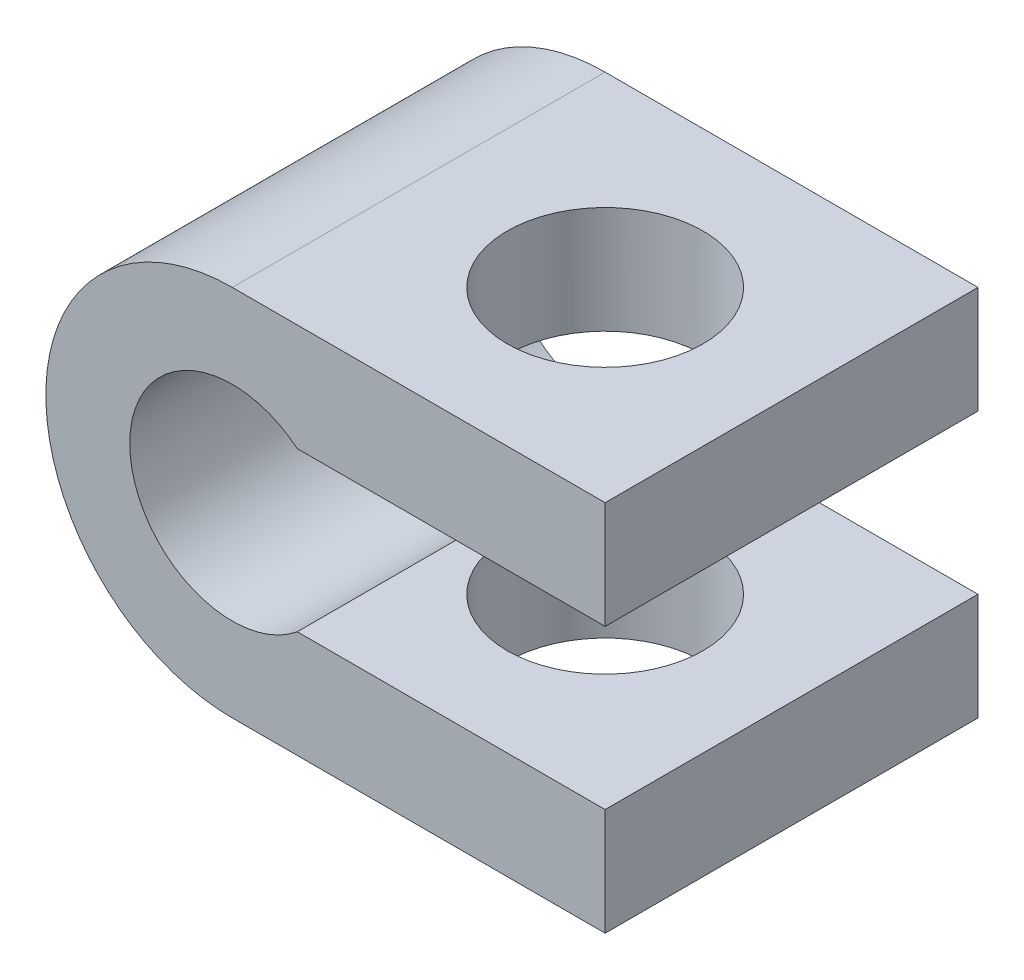
ISO-10303-21;
HEADER;
FILE_DESCRIPTION(('STEP AP214'),'2;1');
FILE_NAME('part.step','',(''),(''),'','','');
FILE_SCHEMA(('AUTOMOTIVE_DESIGN { 1 0 10303 214 1 1 1 1 }'));
ENDSEC;
DATA;
#1=APPLICATION_CONTEXT('core data for automotive mechanical design processes');
#2=APPLICATION_PROTOCOL_DEFINITION('international standard','automotive_design',2000,#1);
#3=PRODUCT_CONTEXT('',#1,'mechanical');
#4=PRODUCT('Part','Part','',(#3));
#5=PRODUCT_RELATED_PRODUCT_CATEGORY('part','',(#4));
#6=PRODUCT_DEFINITION_FORMATION('','',#4);
#7=PRODUCT_DEFINITION_CONTEXT('part definition',#1,'design');
#8=PRODUCT_DEFINITION('design','',#6,#7);
#9=PRODUCT_DEFINITION_SHAPE('','',#8);
#10=(LENGTH_UNIT() NAMED_UNIT(*) SI_UNIT(.MILLI.,.METRE.));
#11=(NAMED_UNIT(*) PLANE_ANGLE_UNIT() SI_UNIT($,.RADIAN.));
#12=(NAMED_UNIT(*) SI_UNIT($,.STERADIAN.) SOLID_ANGLE_UNIT());
#13=UNCERTAINTY_MEASURE_WITH_UNIT(LENGTH_MEASURE(1.E-05),#10,'distance_accuracy_value','');
#14=(GEOMETRIC_REPRESENTATION_CONTEXT(3) GLOBAL_UNCERTAINTY_ASSIGNED_CONTEXT((#13)) GLOBAL_UNIT_ASSIGNED_CONTEXT((#10,
#11,#12)) REPRESENTATION_CONTEXT('',''));
#15=CARTESIAN_POINT('',(0.,0.,0.));
#16=DIRECTION('',(0.,0.,1.));
#17=DIRECTION('',(1.,0.,0.));
#18=AXIS2_PLACEMENT_3D('',#15,#16,#17);
#19=CARTESIAN_POINT('',(0.,0.,12.));
#20=DIRECTION('',(0.,0.,-1.));
#21=DIRECTION('',(-1.,0.,0.));
#22=AXIS2_PLACEMENT_3D('',#19,#20,#21);
#23=CYLINDRICAL_SURFACE('',#22,3.3);
#24=CARTESIAN_POINT('',(0.,0.,0.));
#25=DIRECTION('',(0.,0.,-1.));
#26=DIRECTION('',(1.,0.,0.));
#27=AXIS2_PLACEMENT_3D('',#24,#25,#26);
#28=CIRCLE('',#27,3.3);
#29=CARTESIAN_POINT('',(2.09133180710731,-2.55271057360235,0.));
#30=VERTEX_POINT('',#29);
#31=CARTESIAN_POINT('',(2.09133180710731,2.55271057360235,0.));
#32=VERTEX_POINT('',#31);
#33=EDGE_CURVE('E131',#30,#32,#28,.T.);
#34=ORIENTED_EDGE('',*,*,#33,.T.);
#35=DIRECTION('',(0.,0.,-1.));
#36=VECTOR('',#35,1.);
#37=CARTESIAN_POINT('',(2.09133180710731,2.55271057360235,12.));
#38=LINE('',#37,#36);
#39=CARTESIAN_POINT('',(2.09133180710731,2.55271057360235,12.));
#40=VERTEX_POINT('',#39);
#41=EDGE_CURVE('E11',#40,#32,#38,.T.);
#42=ORIENTED_EDGE('',*,*,#41,.F.);
#43=CARTESIAN_POINT('',(0.,0.,12.));
#44=DIRECTION('',(0.,0.,-1.));
#45=DIRECTION('',(1.,0.,0.));
#46=AXIS2_PLACEMENT_3D('',#43,#44,#45);
#47=CIRCLE('',#46,3.3);
#48=CARTESIAN_POINT('',(2.09133180710731,-2.55271057360235,12.));
#49=VERTEX_POINT('',#48);
#50=EDGE_CURVE('E146',#49,#40,#47,.T.);
#51=ORIENTED_EDGE('',*,*,#50,.F.);
#52=DIRECTION('',(0.,0.,-1.));
#53=VECTOR('',#52,1.);
#54=CARTESIAN_POINT('',(2.09133180710731,-2.55271057360235,12.));
#55=LINE('',#54,#53);
#56=EDGE_CURVE('E127',#49,#30,#55,.T.);
#57=ORIENTED_EDGE('',*,*,#56,.T.);
#58=EDGE_LOOP('',(#34,#42,#51,#57));
#59=FACE_BOUND('',#58,.T.);
#60=ADVANCED_FACE('F34',(#59),#23,.F.);
#61=CARTESIAN_POINT('',(12.,2.55271057360235,12.));
#62=DIRECTION('',(0.,1.,0.));
#63=DIRECTION('',(-1.,0.,0.));
#64=AXIS2_PLACEMENT_3D('',#61,#62,#63);
#65=PLANE('',#64);
#66=CARTESIAN_POINT('',(6.,2.55271057360235,6.));
#67=DIRECTION('',(0.,1.,0.));
#68=DIRECTION('',(-1.,0.,0.));
#69=AXIS2_PLACEMENT_3D('',#66,#67,#68);
#70=CIRCLE('',#69,3.15);
#71=CARTESIAN_POINT('',(2.85,2.55271057360235,6.));
#72=VERTEX_POINT('',#71);
#73=EDGE_CURVE('E135',#72,#72,#70,.T.);
#74=ORIENTED_EDGE('',*,*,#73,.T.);
#75=EDGE_LOOP('',(#74));
#76=FACE_BOUND('',#75,.T.);
#77=DIRECTION('',(1.,0.,0.));
#78=VECTOR('',#77,1.);
#79=CARTESIAN_POINT('',(12.,2.55271057360235,0.));
#80=LINE('',#79,#78);
#81=CARTESIAN_POINT('',(12.,2.55271057360235,0.));
#82=VERTEX_POINT('',#81);
#83=EDGE_CURVE('E134',#32,#82,#80,.T.);
#84=ORIENTED_EDGE('',*,*,#83,.T.);
#85=DIRECTION('',(0.,0.,-1.));
#86=VECTOR('',#85,1.);
#87=CARTESIAN_POINT('',(12.,2.55271057360235,12.));
#88=LINE('',#87,#86);
#89=CARTESIAN_POINT('',(12.,2.55271057360235,12.));
#90=VERTEX_POINT('',#89);
#91=EDGE_CURVE('E43',#90,#82,#88,.T.);
#92=ORIENTED_EDGE('',*,*,#91,.F.);
#93=DIRECTION('',(1.,0.,0.));
#94=VECTOR('',#93,1.);
#95=CARTESIAN_POINT('',(12.,2.55271057360235,12.));
#96=LINE('',#95,#94);
#97=EDGE_CURVE('E94',#40,#90,#96,.T.);
#98=ORIENTED_EDGE('',*,*,#97,.F.);
#99=ORIENTED_EDGE('',*,*,#41,.T.);
#100=EDGE_LOOP('',(#84,#92,#98,#99));
#101=FACE_BOUND('',#100,.T.);
#102=ADVANCED_FACE('F199',(#76,#101),#65,.F.);
#103=CARTESIAN_POINT('',(12.,6.,12.));
#104=DIRECTION('',(-1.,0.,0.));
#105=DIRECTION('',(0.,0.,1.));
#106=AXIS2_PLACEMENT_3D('',#103,#104,#105);
#107=PLANE('',#106);
#108=DIRECTION('',(0.,1.,0.));
#109=VECTOR('',#108,1.);
#110=CARTESIAN_POINT('',(12.,6.,0.));
#111=LINE('',#110,#109);
#112=CARTESIAN_POINT('',(12.,6.,0.));
#113=VERTEX_POINT('',#112);
#114=EDGE_CURVE('E137',#82,#113,#111,.T.);
#115=ORIENTED_EDGE('',*,*,#114,.T.);
#116=DIRECTION('',(0.,0.,-1.));
#117=VECTOR('',#116,1.);
#118=CARTESIAN_POINT('',(12.,6.,12.));
#119=LINE('',#118,#117);
#120=CARTESIAN_POINT('',(12.,6.,12.));
#121=VERTEX_POINT('',#120);
#122=EDGE_CURVE('E153',#121,#113,#119,.T.);
#123=ORIENTED_EDGE('',*,*,#122,.F.);
#124=DIRECTION('',(0.,1.,0.));
#125=VECTOR('',#124,1.);
#126=CARTESIAN_POINT('',(12.,6.,12.));
#127=LINE('',#126,#125);
#128=EDGE_CURVE('E162',#90,#121,#127,.T.);
#129=ORIENTED_EDGE('',*,*,#128,.F.);
#130=ORIENTED_EDGE('',*,*,#91,.T.);
#131=EDGE_LOOP('',(#115,#123,#129,#130));
#132=FACE_BOUND('',#131,.T.);
#133=ADVANCED_FACE('F160',(#132),#107,.F.);
#134=CARTESIAN_POINT('',(0.,6.,12.));
#135=DIRECTION('',(0.,-1.,0.));
#136=DIRECTION('',(0.,0.,-1.));
#137=AXIS2_PLACEMENT_3D('',#134,#135,#136);
#138=PLANE('',#137);
#139=CARTESIAN_POINT('',(6.,6.,6.));
#140=DIRECTION('',(0.,1.,0.));
#141=DIRECTION('',(0.,0.,1.));
#142=AXIS2_PLACEMENT_3D('',#139,#140,#141);
#143=CIRCLE('',#142,3.15);
#144=CARTESIAN_POINT('',(6.,6.,9.15));
#145=VERTEX_POINT('',#144);
#146=EDGE_CURVE('E185',#145,#145,#143,.T.);
#147=ORIENTED_EDGE('',*,*,#146,.F.);
#148=EDGE_LOOP('',(#147));
#149=FACE_BOUND('',#148,.T.);
#150=DIRECTION('',(-1.,0.,0.));
#151=VECTOR('',#150,1.);
#152=CARTESIAN_POINT('',(0.,6.,0.));
#153=LINE('',#152,#151);
#154=CARTESIAN_POINT('',(0.,6.,0.));
#155=VERTEX_POINT('',#154);
#156=EDGE_CURVE('E139',#113,#155,#153,.T.);
#157=ORIENTED_EDGE('',*,*,#156,.T.);
#158=DIRECTION('',(0.,0.,-1.));
#159=VECTOR('',#158,1.);
#160=CARTESIAN_POINT('',(0.,6.,12.));
#161=LINE('',#160,#159);
#162=CARTESIAN_POINT('',(0.,6.,12.));
#163=VERTEX_POINT('',#162);
#164=EDGE_CURVE('E150',#163,#155,#161,.T.);
#165=ORIENTED_EDGE('',*,*,#164,.F.);
#166=DIRECTION('',(-1.,0.,0.));
#167=VECTOR('',#166,1.);
#168=CARTESIAN_POINT('',(0.,6.,12.));
#169=LINE('',#168,#167);
#170=EDGE_CURVE('E174',#121,#163,#169,.T.);
#171=ORIENTED_EDGE('',*,*,#170,.F.);
#172=ORIENTED_EDGE('',*,*,#122,.T.);
#173=EDGE_LOOP('',(#157,#165,#171,#172));
#174=FACE_BOUND('',#173,.T.);
#175=ADVANCED_FACE('F170',(#149,#174),#138,.F.);
#176=CARTESIAN_POINT('',(0.,0.,12.));
#177=DIRECTION('',(0.,0.,-1.));
#178=DIRECTION('',(-1.,0.,0.));
#179=AXIS2_PLACEMENT_3D('',#176,#177,#178);
#180=CYLINDRICAL_SURFACE('',#179,6.);
#181=CARTESIAN_POINT('',(0.,0.,0.));
#182=DIRECTION('',(0.,0.,1.));
#183=DIRECTION('',(1.,0.,0.));
#184=AXIS2_PLACEMENT_3D('',#181,#182,#183);
#185=CIRCLE('',#184,6.);
#186=CARTESIAN_POINT('',(0.,-6.,0.));
#187=VERTEX_POINT('',#186);
#188=EDGE_CURVE('E141',#155,#187,#185,.T.);
#189=ORIENTED_EDGE('',*,*,#188,.T.);
#190=DIRECTION('',(0.,0.,-1.));
#191=VECTOR('',#190,1.);
#192=CARTESIAN_POINT('',(0.,-6.,12.));
#193=LINE('',#192,#191);
#194=CARTESIAN_POINT('',(0.,-6.,12.));
#195=VERTEX_POINT('',#194);
#196=EDGE_CURVE('E122',#195,#187,#193,.T.);
#197=ORIENTED_EDGE('',*,*,#196,.F.);
#198=CARTESIAN_POINT('',(0.,0.,12.));
#199=DIRECTION('',(0.,0.,1.));
#200=DIRECTION('',(1.,0.,0.));
#201=AXIS2_PLACEMENT_3D('',#198,#199,#200);
#202=CIRCLE('',#201,6.);
#203=EDGE_CURVE('E113',#163,#195,#202,.T.);
#204=ORIENTED_EDGE('',*,*,#203,.F.);
#205=ORIENTED_EDGE('',*,*,#164,.T.);
#206=EDGE_LOOP('',(#189,#197,#204,#205));
#207=FACE_BOUND('',#206,.T.);
#208=ADVANCED_FACE('F173',(#207),#180,.T.);
#209=CARTESIAN_POINT('',(0.,-6.,12.));
#210=DIRECTION('',(0.,1.,0.));
#211=DIRECTION('',(0.,0.,1.));
#212=AXIS2_PLACEMENT_3D('',#209,#210,#211);
#213=PLANE('',#212);
#214=CARTESIAN_POINT('',(6.,-6.,6.));
#215=DIRECTION('',(0.,1.,0.));
#216=DIRECTION('',(0.,0.,1.));
#217=AXIS2_PLACEMENT_3D('',#214,#215,#216);
#218=CIRCLE('',#217,3.15);
#219=CARTESIAN_POINT('',(6.,-6.,9.15));
#220=VERTEX_POINT('',#219);
#221=EDGE_CURVE('E182',#220,#220,#218,.T.);
#222=ORIENTED_EDGE('',*,*,#221,.T.);
#223=EDGE_LOOP('',(#222));
#224=FACE_BOUND('',#223,.T.);
#225=DIRECTION('',(1.,0.,0.));
#226=VECTOR('',#225,1.);
#227=CARTESIAN_POINT('',(0.,-6.,0.));
#228=LINE('',#227,#226);
#229=CARTESIAN_POINT('',(12.,-6.,0.));
#230=VERTEX_POINT('',#229);
#231=EDGE_CURVE('E121',#187,#230,#228,.T.);
#232=ORIENTED_EDGE('',*,*,#231,.T.);
#233=DIRECTION('',(0.,0.,-1.));
#234=VECTOR('',#233,1.);
#235=CARTESIAN_POINT('',(12.,-6.,12.));
#236=LINE('',#235,#234);
#237=CARTESIAN_POINT('',(12.,-6.,12.));
#238=VERTEX_POINT('',#237);
#239=EDGE_CURVE('E118',#238,#230,#236,.T.);
#240=ORIENTED_EDGE('',*,*,#239,.F.);
#241=DIRECTION('',(1.,0.,0.));
#242=VECTOR('',#241,1.);
#243=CARTESIAN_POINT('',(0.,-6.,12.));
#244=LINE('',#243,#242);
#245=EDGE_CURVE('E107',#195,#238,#244,.T.);
#246=ORIENTED_EDGE('',*,*,#245,.F.);
#247=ORIENTED_EDGE('',*,*,#196,.T.);
#248=EDGE_LOOP('',(#232,#240,#246,#247));
#249=FACE_BOUND('',#248,.T.);
#250=ADVANCED_FACE('F119',(#224,#249),#213,.F.);
#251=CARTESIAN_POINT('',(12.,-6.,12.));
#252=DIRECTION('',(-1.,0.,0.));
#253=DIRECTION('',(0.,0.,1.));
#254=AXIS2_PLACEMENT_3D('',#251,#252,#253);
#255=PLANE('',#254);
#256=DIRECTION('',(0.,1.,0.));
#257=VECTOR('',#256,1.);
#258=CARTESIAN_POINT('',(12.,-6.,0.));
#259=LINE('',#258,#257);
#260=CARTESIAN_POINT('',(12.,-2.55271057360235,0.));
#261=VERTEX_POINT('',#260);
#262=EDGE_CURVE('E80',#230,#261,#259,.T.);
#263=ORIENTED_EDGE('',*,*,#262,.T.);
#264=DIRECTION('',(0.,0.,-1.));
#265=VECTOR('',#264,1.);
#266=CARTESIAN_POINT('',(12.,-2.55271057360235,12.));
#267=LINE('',#266,#265);
#268=CARTESIAN_POINT('',(12.,-2.55271057360235,12.));
#269=VERTEX_POINT('',#268);
#270=EDGE_CURVE('E123',#269,#261,#267,.T.);
#271=ORIENTED_EDGE('',*,*,#270,.F.);
#272=DIRECTION('',(0.,1.,0.));
#273=VECTOR('',#272,1.);
#274=CARTESIAN_POINT('',(12.,-6.,12.));
#275=LINE('',#274,#273);
#276=EDGE_CURVE('E111',#238,#269,#275,.T.);
#277=ORIENTED_EDGE('',*,*,#276,.F.);
#278=ORIENTED_EDGE('',*,*,#239,.T.);
#279=EDGE_LOOP('',(#263,#271,#277,#278));
#280=FACE_BOUND('',#279,.T.);
#281=ADVANCED_FACE('F125',(#280),#255,.F.);
#282=CARTESIAN_POINT('',(12.,-2.55271057360235,12.));
#283=DIRECTION('',(0.,-1.,0.));
#284=DIRECTION('',(1.,0.,0.));
#285=AXIS2_PLACEMENT_3D('',#282,#283,#284);
#286=PLANE('',#285);
#287=CARTESIAN_POINT('',(6.,-2.55271057360235,6.));
#288=DIRECTION('',(0.,-1.,0.));
#289=DIRECTION('',(1.,0.,0.));
#290=AXIS2_PLACEMENT_3D('',#287,#288,#289);
#291=CIRCLE('',#290,3.15);
#292=CARTESIAN_POINT('',(9.15,-2.55271057360235,6.));
#293=VERTEX_POINT('',#292);
#294=EDGE_CURVE('E37',#293,#293,#291,.T.);
#295=ORIENTED_EDGE('',*,*,#294,.T.);
#296=EDGE_LOOP('',(#295));
#297=FACE_BOUND('',#296,.T.);
#298=DIRECTION('',(-1.,0.,0.));
#299=VECTOR('',#298,1.);
#300=CARTESIAN_POINT('',(12.,-2.55271057360235,0.));
#301=LINE('',#300,#299);
#302=EDGE_CURVE('E86',#261,#30,#301,.T.);
#303=ORIENTED_EDGE('',*,*,#302,.T.);
#304=ORIENTED_EDGE('',*,*,#56,.F.);
#305=DIRECTION('',(-1.,0.,0.));
#306=VECTOR('',#305,1.);
#307=CARTESIAN_POINT('',(12.,-2.55271057360235,12.));
#308=LINE('',#307,#306);
#309=EDGE_CURVE('E51',#269,#49,#308,.T.);
#310=ORIENTED_EDGE('',*,*,#309,.F.);
#311=ORIENTED_EDGE('',*,*,#270,.T.);
#312=EDGE_LOOP('',(#303,#304,#310,#311));
#313=FACE_BOUND('',#312,.T.);
#314=ADVANCED_FACE('F209',(#297,#313),#286,.F.);
#315=CARTESIAN_POINT('',(0.,0.,12.));
#316=DIRECTION('',(0.,0.,1.));
#317=DIRECTION('',(1.,0.,0.));
#318=AXIS2_PLACEMENT_3D('',#315,#316,#317);
#319=PLANE('',#318);
#320=ORIENTED_EDGE('',*,*,#50,.T.);
#321=ORIENTED_EDGE('',*,*,#97,.T.);
#322=ORIENTED_EDGE('',*,*,#128,.T.);
#323=ORIENTED_EDGE('',*,*,#170,.T.);
#324=ORIENTED_EDGE('',*,*,#203,.T.);
#325=ORIENTED_EDGE('',*,*,#245,.T.);
#326=ORIENTED_EDGE('',*,*,#276,.T.);
#327=ORIENTED_EDGE('',*,*,#309,.T.);
#328=EDGE_LOOP('',(#320,#321,#322,#323,#324,#325,#326,#327));
#329=FACE_BOUND('',#328,.T.);
#330=ADVANCED_FACE('F109',(#329),#319,.T.);
#331=CARTESIAN_POINT('',(0.,0.,0.));
#332=DIRECTION('',(0.,0.,1.));
#333=DIRECTION('',(1.,0.,0.));
#334=AXIS2_PLACEMENT_3D('',#331,#332,#333);
#335=PLANE('',#334);
#336=ORIENTED_EDGE('',*,*,#33,.F.);
#337=ORIENTED_EDGE('',*,*,#302,.F.);
#338=ORIENTED_EDGE('',*,*,#262,.F.);
#339=ORIENTED_EDGE('',*,*,#231,.F.);
#340=ORIENTED_EDGE('',*,*,#188,.F.);
#341=ORIENTED_EDGE('',*,*,#156,.F.);
#342=ORIENTED_EDGE('',*,*,#114,.F.);
#343=ORIENTED_EDGE('',*,*,#83,.F.);
#344=EDGE_LOOP('',(#336,#337,#338,#339,#340,#341,#342,#343));
#345=FACE_BOUND('',#344,.T.);
#346=ADVANCED_FACE('F166',(#345),#335,.F.);
#347=CARTESIAN_POINT('',(6.,-6.,6.));
#348=DIRECTION('',(0.,1.,0.));
#349=DIRECTION('',(0.,0.,1.));
#350=AXIS2_PLACEMENT_3D('',#347,#348,#349);
#351=CYLINDRICAL_SURFACE('',#350,3.15);
#352=ORIENTED_EDGE('',*,*,#221,.F.);
#353=EDGE_LOOP('',(#352));
#354=FACE_BOUND('',#353,.T.);
#355=ORIENTED_EDGE('',*,*,#294,.F.);
#356=EDGE_LOOP('',(#355));
#357=FACE_BOUND('',#356,.T.);
#358=ADVANCED_FACE('F228',(#354,#357),#351,.F.);
#359=ORIENTED_EDGE('',*,*,#146,.T.);
#360=EDGE_LOOP('',(#359));
#361=FACE_BOUND('',#360,.T.);
#362=ORIENTED_EDGE('',*,*,#73,.F.);
#363=EDGE_LOOP('',(#362));
#364=FACE_BOUND('',#363,.T.);
#365=ADVANCED_FACE('F189',(#361,#364),#351,.F.);
#366=CLOSED_SHELL('',(#60,#102,#133,#175,#208,#250,#281,#314,#330,#346,#358,#365));
#367=MANIFOLD_SOLID_BREP('B2',#366);
#368=ADVANCED_BREP_SHAPE_REPRESENTATION('',(#18,#367),#14);
#369=SHAPE_DEFINITION_REPRESENTATION(#9,#368);
ENDSEC;
END-ISO-10303-21;
